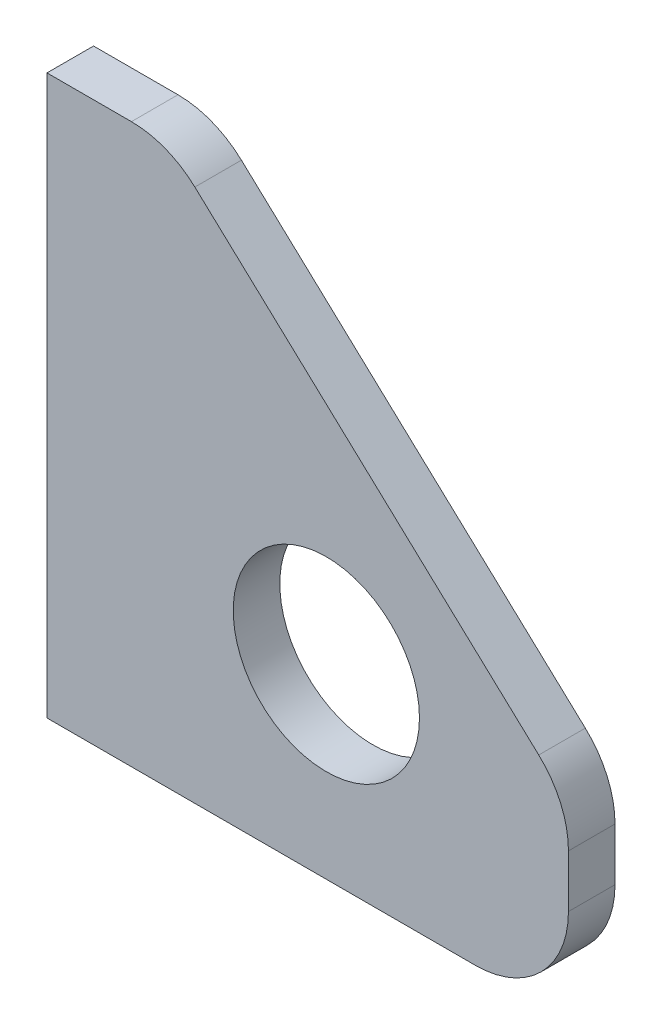
ISO-10303-21;
HEADER;
FILE_DESCRIPTION(('STEP AP214'),'2;1');
FILE_NAME('part.step','',(''),(''),'','','');
FILE_SCHEMA(('AUTOMOTIVE_DESIGN { 1 0 10303 214 1 1 1 1 }'));
ENDSEC;
DATA;
#1=APPLICATION_CONTEXT('core data for automotive mechanical design processes');
#2=APPLICATION_PROTOCOL_DEFINITION('international standard','automotive_design',2000,#1);
#3=PRODUCT_CONTEXT('',#1,'mechanical');
#4=PRODUCT('Part','Part','',(#3));
#5=PRODUCT_RELATED_PRODUCT_CATEGORY('part','',(#4));
#6=PRODUCT_DEFINITION_FORMATION('','',#4);
#7=PRODUCT_DEFINITION_CONTEXT('part definition',#1,'design');
#8=PRODUCT_DEFINITION('design','',#6,#7);
#9=PRODUCT_DEFINITION_SHAPE('','',#8);
#10=(LENGTH_UNIT() NAMED_UNIT(*) SI_UNIT(.MILLI.,.METRE.));
#11=(NAMED_UNIT(*) PLANE_ANGLE_UNIT() SI_UNIT($,.RADIAN.));
#12=(NAMED_UNIT(*) SI_UNIT($,.STERADIAN.) SOLID_ANGLE_UNIT());
#13=UNCERTAINTY_MEASURE_WITH_UNIT(LENGTH_MEASURE(1.E-05),#10,'distance_accuracy_value','');
#14=(GEOMETRIC_REPRESENTATION_CONTEXT(3) GLOBAL_UNCERTAINTY_ASSIGNED_CONTEXT((#13)) GLOBAL_UNIT_ASSIGNED_CONTEXT((#10,
#11,#12)) REPRESENTATION_CONTEXT('',''));
#15=CARTESIAN_POINT('',(0.,0.,0.));
#16=DIRECTION('',(0.,0.,1.));
#17=DIRECTION('',(1.,0.,0.));
#18=AXIS2_PLACEMENT_3D('',#15,#16,#17);
#19=CARTESIAN_POINT('',(0.,0.,5.));
#20=DIRECTION('',(0.,0.,-1.));
#21=DIRECTION('',(-1.,0.,0.));
#22=AXIS2_PLACEMENT_3D('',#19,#20,#21);
#23=PLANE('',#22);
#24=DIRECTION('',(1.,0.,0.));
#25=VECTOR('',#24,1.);
#26=CARTESIAN_POINT('',(26.,-20.,5.));
#27=LINE('',#26,#25);
#28=CARTESIAN_POINT('',(-30.,-20.,5.));
#29=VERTEX_POINT('',#28);
#30=CARTESIAN_POINT('',(16.,-20.,5.));
#31=VERTEX_POINT('',#30);
#32=EDGE_CURVE('E142',#29,#31,#27,.T.);
#33=ORIENTED_EDGE('',*,*,#32,.T.);
#34=CARTESIAN_POINT('',(16.,-10.,5.));
#35=DIRECTION('',(0.,0.,-1.));
#36=DIRECTION('',(-1.,0.,0.));
#37=AXIS2_PLACEMENT_3D('',#34,#35,#36);
#38=CIRCLE('',#37,10.);
#39=CARTESIAN_POINT('',(26.,-10.,5.));
#40=VERTEX_POINT('',#39);
#41=EDGE_CURVE('E159',#31,#40,#38,.F.);
#42=ORIENTED_EDGE('',*,*,#41,.T.);
#43=DIRECTION('',(0.,1.,0.));
#44=VECTOR('',#43,1.);
#45=CARTESIAN_POINT('',(26.,0.,5.));
#46=LINE('',#45,#44);
#47=CARTESIAN_POINT('',(26.,-4.35539242793117,5.));
#48=VERTEX_POINT('',#47);
#49=EDGE_CURVE('E212',#40,#48,#46,.T.);
#50=ORIENTED_EDGE('',*,*,#49,.T.);
#51=CARTESIAN_POINT('',(16.,-4.35539242793117,5.));
#52=DIRECTION('',(0.,0.,-1.));
#53=DIRECTION('',(-1.,0.,0.));
#54=AXIS2_PLACEMENT_3D('',#51,#52,#53);
#55=CIRCLE('',#54,10.);
#56=CARTESIAN_POINT('',(22.8110394247729,2.96647495369966,5.));
#57=VERTEX_POINT('',#56);
#58=EDGE_CURVE('E157',#48,#57,#55,.F.);
#59=ORIENTED_EDGE('',*,*,#58,.T.);
#60=DIRECTION('',(-0.732186738163084,0.681103942477287,0.));
#61=VECTOR('',#60,1.);
#62=CARTESIAN_POINT('',(-17.,40.,5.));
#63=LINE('',#62,#61);
#64=CARTESIAN_POINT('',(-14.1210074352531,37.3218673816308,5.));
#65=VERTEX_POINT('',#64);
#66=EDGE_CURVE('E113',#57,#65,#63,.T.);
#67=ORIENTED_EDGE('',*,*,#66,.T.);
#68=CARTESIAN_POINT('',(-20.932046860026,30.,5.));
#69=DIRECTION('',(0.,0.,-1.));
#70=DIRECTION('',(-1.,0.,0.));
#71=AXIS2_PLACEMENT_3D('',#68,#69,#70);
#72=CIRCLE('',#71,10.);
#73=CARTESIAN_POINT('',(-20.932046860026,40.,5.));
#74=VERTEX_POINT('',#73);
#75=EDGE_CURVE('E54',#65,#74,#72,.F.);
#76=ORIENTED_EDGE('',*,*,#75,.T.);
#77=DIRECTION('',(-1.,0.,0.));
#78=VECTOR('',#77,1.);
#79=CARTESIAN_POINT('',(-30.,40.,5.));
#80=LINE('',#79,#78);
#81=CARTESIAN_POINT('',(-30.,40.,5.));
#82=VERTEX_POINT('',#81);
#83=EDGE_CURVE('E104',#74,#82,#80,.T.);
#84=ORIENTED_EDGE('',*,*,#83,.T.);
#85=DIRECTION('',(0.,-1.,0.));
#86=VECTOR('',#85,1.);
#87=CARTESIAN_POINT('',(-30.,-20.,5.));
#88=LINE('',#87,#86);
#89=EDGE_CURVE('E109',#82,#29,#88,.T.);
#90=ORIENTED_EDGE('',*,*,#89,.T.);
#91=EDGE_LOOP('',(#33,#42,#50,#59,#67,#76,#84,#90));
#92=FACE_BOUND('',#91,.T.);
#93=CARTESIAN_POINT('',(0.,0.,5.));
#94=DIRECTION('',(0.,0.,1.));
#95=DIRECTION('',(1.,0.,0.));
#96=AXIS2_PLACEMENT_3D('',#93,#94,#95);
#97=CIRCLE('',#96,10.);
#98=CARTESIAN_POINT('',(10.,0.,5.));
#99=VERTEX_POINT('',#98);
#100=EDGE_CURVE('E135',#99,#99,#97,.T.);
#101=ORIENTED_EDGE('',*,*,#100,.F.);
#102=EDGE_LOOP('',(#101));
#103=FACE_BOUND('',#102,.T.);
#104=ADVANCED_FACE('F39',(#92,#103),#23,.F.);
#105=CARTESIAN_POINT('',(0.,0.,0.));
#106=DIRECTION('',(0.,0.,-1.));
#107=DIRECTION('',(-1.,0.,0.));
#108=AXIS2_PLACEMENT_3D('',#105,#106,#107);
#109=PLANE('',#108);
#110=DIRECTION('',(0.,1.,0.));
#111=VECTOR('',#110,1.);
#112=CARTESIAN_POINT('',(26.,0.,0.));
#113=LINE('',#112,#111);
#114=CARTESIAN_POINT('',(26.,-10.,0.));
#115=VERTEX_POINT('',#114);
#116=CARTESIAN_POINT('',(26.,-4.35539242793117,0.));
#117=VERTEX_POINT('',#116);
#118=EDGE_CURVE('E131',#115,#117,#113,.T.);
#119=ORIENTED_EDGE('',*,*,#118,.F.);
#120=CARTESIAN_POINT('',(16.,-10.,0.));
#121=DIRECTION('',(0.,0.,-1.));
#122=DIRECTION('',(-1.,0.,0.));
#123=AXIS2_PLACEMENT_3D('',#120,#121,#122);
#124=CIRCLE('',#123,10.);
#125=CARTESIAN_POINT('',(16.,-20.,0.));
#126=VERTEX_POINT('',#125);
#127=EDGE_CURVE('E152',#115,#126,#124,.T.);
#128=ORIENTED_EDGE('',*,*,#127,.T.);
#129=DIRECTION('',(1.,0.,0.));
#130=VECTOR('',#129,1.);
#131=CARTESIAN_POINT('',(0.,-20.,0.));
#132=LINE('',#131,#130);
#133=CARTESIAN_POINT('',(-30.,-20.,0.));
#134=VERTEX_POINT('',#133);
#135=EDGE_CURVE('E140',#134,#126,#132,.T.);
#136=ORIENTED_EDGE('',*,*,#135,.F.);
#137=DIRECTION('',(0.,-1.,0.));
#138=VECTOR('',#137,1.);
#139=CARTESIAN_POINT('',(-30.,-20.,0.));
#140=LINE('',#139,#138);
#141=CARTESIAN_POINT('',(-30.,40.,0.));
#142=VERTEX_POINT('',#141);
#143=EDGE_CURVE('E138',#142,#134,#140,.T.);
#144=ORIENTED_EDGE('',*,*,#143,.F.);
#145=DIRECTION('',(-1.,0.,0.));
#146=VECTOR('',#145,1.);
#147=CARTESIAN_POINT('',(-30.,40.,0.));
#148=LINE('',#147,#146);
#149=CARTESIAN_POINT('',(-20.932046860026,40.,0.));
#150=VERTEX_POINT('',#149);
#151=EDGE_CURVE('E119',#150,#142,#148,.T.);
#152=ORIENTED_EDGE('',*,*,#151,.F.);
#153=CARTESIAN_POINT('',(-20.932046860026,30.,0.));
#154=DIRECTION('',(0.,0.,-1.));
#155=DIRECTION('',(-1.,0.,0.));
#156=AXIS2_PLACEMENT_3D('',#153,#154,#155);
#157=CIRCLE('',#156,10.);
#158=CARTESIAN_POINT('',(-14.1210074352531,37.3218673816308,0.));
#159=VERTEX_POINT('',#158);
#160=EDGE_CURVE('E148',#150,#159,#157,.T.);
#161=ORIENTED_EDGE('',*,*,#160,.T.);
#162=DIRECTION('',(-0.732186738163084,0.681103942477287,0.));
#163=VECTOR('',#162,1.);
#164=CARTESIAN_POINT('',(-17.,40.,0.));
#165=LINE('',#164,#163);
#166=CARTESIAN_POINT('',(22.8110394247729,2.96647495369966,0.));
#167=VERTEX_POINT('',#166);
#168=EDGE_CURVE('E134',#167,#159,#165,.T.);
#169=ORIENTED_EDGE('',*,*,#168,.F.);
#170=CARTESIAN_POINT('',(16.,-4.35539242793117,0.));
#171=DIRECTION('',(0.,0.,-1.));
#172=DIRECTION('',(-1.,0.,0.));
#173=AXIS2_PLACEMENT_3D('',#170,#171,#172);
#174=CIRCLE('',#173,10.);
#175=EDGE_CURVE('E150',#167,#117,#174,.T.);
#176=ORIENTED_EDGE('',*,*,#175,.T.);
#177=EDGE_LOOP('',(#119,#128,#136,#144,#152,#161,#169,#176));
#178=FACE_BOUND('',#177,.T.);
#179=CARTESIAN_POINT('',(0.,0.,0.));
#180=DIRECTION('',(0.,0.,1.));
#181=DIRECTION('',(1.,0.,0.));
#182=AXIS2_PLACEMENT_3D('',#179,#180,#181);
#183=CIRCLE('',#182,10.);
#184=CARTESIAN_POINT('',(10.,0.,0.));
#185=VERTEX_POINT('',#184);
#186=EDGE_CURVE('E217',#185,#185,#183,.T.);
#187=ORIENTED_EDGE('',*,*,#186,.T.);
#188=EDGE_LOOP('',(#187));
#189=FACE_BOUND('',#188,.T.);
#190=ADVANCED_FACE('F169',(#178,#189),#109,.T.);
#191=CARTESIAN_POINT('',(26.,0.,5.));
#192=DIRECTION('',(-1.,0.,0.));
#193=DIRECTION('',(0.,-1.,0.));
#194=AXIS2_PLACEMENT_3D('',#191,#192,#193);
#195=PLANE('',#194);
#196=ORIENTED_EDGE('',*,*,#49,.F.);
#197=DIRECTION('',(0.,0.,-1.));
#198=VECTOR('',#197,1.);
#199=CARTESIAN_POINT('',(26.,-10.,5.));
#200=LINE('',#199,#198);
#201=EDGE_CURVE('E145',#40,#115,#200,.T.);
#202=ORIENTED_EDGE('',*,*,#201,.T.);
#203=ORIENTED_EDGE('',*,*,#118,.T.);
#204=DIRECTION('',(0.,0.,-1.));
#205=VECTOR('',#204,1.);
#206=CARTESIAN_POINT('',(26.,-4.35539242793117,5.));
#207=LINE('',#206,#205);
#208=EDGE_CURVE('E122',#117,#48,#207,.F.);
#209=ORIENTED_EDGE('',*,*,#208,.T.);
#210=EDGE_LOOP('',(#196,#202,#203,#209));
#211=FACE_BOUND('',#210,.T.);
#212=ADVANCED_FACE('F183',(#211),#195,.F.);
#213=CARTESIAN_POINT('',(-17.,40.,5.));
#214=DIRECTION('',(-0.681103942477287,-0.732186738163084,0.));
#215=DIRECTION('',(0.732186738163084,-0.681103942477287,0.));
#216=AXIS2_PLACEMENT_3D('',#213,#214,#215);
#217=PLANE('',#216);
#218=ORIENTED_EDGE('',*,*,#66,.F.);
#219=DIRECTION('',(0.,0.,-1.));
#220=VECTOR('',#219,1.);
#221=CARTESIAN_POINT('',(22.8110394247729,2.96647495369966,5.));
#222=LINE('',#221,#220);
#223=EDGE_CURVE('E47',#57,#167,#222,.T.);
#224=ORIENTED_EDGE('',*,*,#223,.T.);
#225=ORIENTED_EDGE('',*,*,#168,.T.);
#226=DIRECTION('',(0.,0.,-1.));
#227=VECTOR('',#226,1.);
#228=CARTESIAN_POINT('',(-14.1210074352531,37.3218673816308,5.));
#229=LINE('',#228,#227);
#230=EDGE_CURVE('E62',#159,#65,#229,.F.);
#231=ORIENTED_EDGE('',*,*,#230,.T.);
#232=EDGE_LOOP('',(#218,#224,#225,#231));
#233=FACE_BOUND('',#232,.T.);
#234=ADVANCED_FACE('F164',(#233),#217,.F.);
#235=CARTESIAN_POINT('',(-30.,40.,5.));
#236=DIRECTION('',(0.,-1.,0.));
#237=DIRECTION('',(0.,0.,-1.));
#238=AXIS2_PLACEMENT_3D('',#235,#236,#237);
#239=PLANE('',#238);
#240=ORIENTED_EDGE('',*,*,#83,.F.);
#241=DIRECTION('',(0.,0.,-1.));
#242=VECTOR('',#241,1.);
#243=CARTESIAN_POINT('',(-20.932046860026,40.,5.));
#244=LINE('',#243,#242);
#245=EDGE_CURVE('E11',#74,#150,#244,.T.);
#246=ORIENTED_EDGE('',*,*,#245,.T.);
#247=ORIENTED_EDGE('',*,*,#151,.T.);
#248=DIRECTION('',(0.,0.,-1.));
#249=VECTOR('',#248,1.);
#250=CARTESIAN_POINT('',(-30.,40.,5.));
#251=LINE('',#250,#249);
#252=EDGE_CURVE('E116',#82,#142,#251,.T.);
#253=ORIENTED_EDGE('',*,*,#252,.F.);
#254=EDGE_LOOP('',(#240,#246,#247,#253));
#255=FACE_BOUND('',#254,.T.);
#256=ADVANCED_FACE('F117',(#255),#239,.F.);
#257=CARTESIAN_POINT('',(-30.,-20.,5.));
#258=DIRECTION('',(1.,0.,0.));
#259=DIRECTION('',(0.,0.,-1.));
#260=AXIS2_PLACEMENT_3D('',#257,#258,#259);
#261=PLANE('',#260);
#262=ORIENTED_EDGE('',*,*,#143,.T.);
#263=DIRECTION('',(0.,0.,-1.));
#264=VECTOR('',#263,1.);
#265=CARTESIAN_POINT('',(-30.,-20.,5.));
#266=LINE('',#265,#264);
#267=EDGE_CURVE('E123',#29,#134,#266,.T.);
#268=ORIENTED_EDGE('',*,*,#267,.F.);
#269=ORIENTED_EDGE('',*,*,#89,.F.);
#270=ORIENTED_EDGE('',*,*,#252,.T.);
#271=EDGE_LOOP('',(#262,#268,#269,#270));
#272=FACE_BOUND('',#271,.T.);
#273=ADVANCED_FACE('F125',(#272),#261,.F.);
#274=CARTESIAN_POINT('',(0.,-20.,5.));
#275=DIRECTION('',(0.,1.,0.));
#276=DIRECTION('',(-1.,0.,0.));
#277=AXIS2_PLACEMENT_3D('',#274,#275,#276);
#278=PLANE('',#277);
#279=ORIENTED_EDGE('',*,*,#135,.T.);
#280=DIRECTION('',(0.,0.,-1.));
#281=VECTOR('',#280,1.);
#282=CARTESIAN_POINT('',(16.,-20.,5.));
#283=LINE('',#282,#281);
#284=EDGE_CURVE('E154',#126,#31,#283,.F.);
#285=ORIENTED_EDGE('',*,*,#284,.T.);
#286=ORIENTED_EDGE('',*,*,#32,.F.);
#287=ORIENTED_EDGE('',*,*,#267,.T.);
#288=EDGE_LOOP('',(#279,#285,#286,#287));
#289=FACE_BOUND('',#288,.T.);
#290=ADVANCED_FACE('F188',(#289),#278,.F.);
#291=CARTESIAN_POINT('',(0.,0.,5.));
#292=DIRECTION('',(0.,0.,-1.));
#293=DIRECTION('',(-1.,0.,0.));
#294=AXIS2_PLACEMENT_3D('',#291,#292,#293);
#295=CYLINDRICAL_SURFACE('',#294,10.);
#296=ORIENTED_EDGE('',*,*,#100,.T.);
#297=EDGE_LOOP('',(#296));
#298=FACE_BOUND('',#297,.T.);
#299=ORIENTED_EDGE('',*,*,#186,.F.);
#300=EDGE_LOOP('',(#299));
#301=FACE_BOUND('',#300,.T.);
#302=ADVANCED_FACE('F186',(#298,#301),#295,.F.);
#303=CARTESIAN_POINT('',(16.,-10.,5.));
#304=DIRECTION('',(0.,0.,-1.));
#305=DIRECTION('',(-1.,0.,0.));
#306=AXIS2_PLACEMENT_3D('',#303,#304,#305);
#307=CYLINDRICAL_SURFACE('',#306,10.);
#308=ORIENTED_EDGE('',*,*,#41,.F.);
#309=ORIENTED_EDGE('',*,*,#284,.F.);
#310=ORIENTED_EDGE('',*,*,#127,.F.);
#311=ORIENTED_EDGE('',*,*,#201,.F.);
#312=EDGE_LOOP('',(#308,#309,#310,#311));
#313=FACE_BOUND('',#312,.T.);
#314=ADVANCED_FACE('F177',(#313),#307,.T.);
#315=CARTESIAN_POINT('',(16.,-4.35539242793117,5.));
#316=DIRECTION('',(0.,0.,-1.));
#317=DIRECTION('',(-1.,0.,0.));
#318=AXIS2_PLACEMENT_3D('',#315,#316,#317);
#319=CYLINDRICAL_SURFACE('',#318,10.);
#320=ORIENTED_EDGE('',*,*,#58,.F.);
#321=ORIENTED_EDGE('',*,*,#208,.F.);
#322=ORIENTED_EDGE('',*,*,#175,.F.);
#323=ORIENTED_EDGE('',*,*,#223,.F.);
#324=EDGE_LOOP('',(#320,#321,#322,#323));
#325=FACE_BOUND('',#324,.T.);
#326=ADVANCED_FACE('F173',(#325),#319,.T.);
#327=CARTESIAN_POINT('',(-20.932046860026,30.,5.));
#328=DIRECTION('',(0.,0.,-1.));
#329=DIRECTION('',(-1.,0.,0.));
#330=AXIS2_PLACEMENT_3D('',#327,#328,#329);
#331=CYLINDRICAL_SURFACE('',#330,10.);
#332=ORIENTED_EDGE('',*,*,#75,.F.);
#333=ORIENTED_EDGE('',*,*,#230,.F.);
#334=ORIENTED_EDGE('',*,*,#160,.F.);
#335=ORIENTED_EDGE('',*,*,#245,.F.);
#336=EDGE_LOOP('',(#332,#333,#334,#335));
#337=FACE_BOUND('',#336,.T.);
#338=ADVANCED_FACE('F41',(#337),#331,.T.);
#339=CLOSED_SHELL('',(#104,#190,#212,#234,#256,#273,#290,#302,#314,#326,#338));
#340=MANIFOLD_SOLID_BREP('B2',#339);
#341=ADVANCED_BREP_SHAPE_REPRESENTATION('',(#18,#340),#14);
#342=SHAPE_DEFINITION_REPRESENTATION(#9,#341);
ENDSEC;
END-ISO-10303-21;
